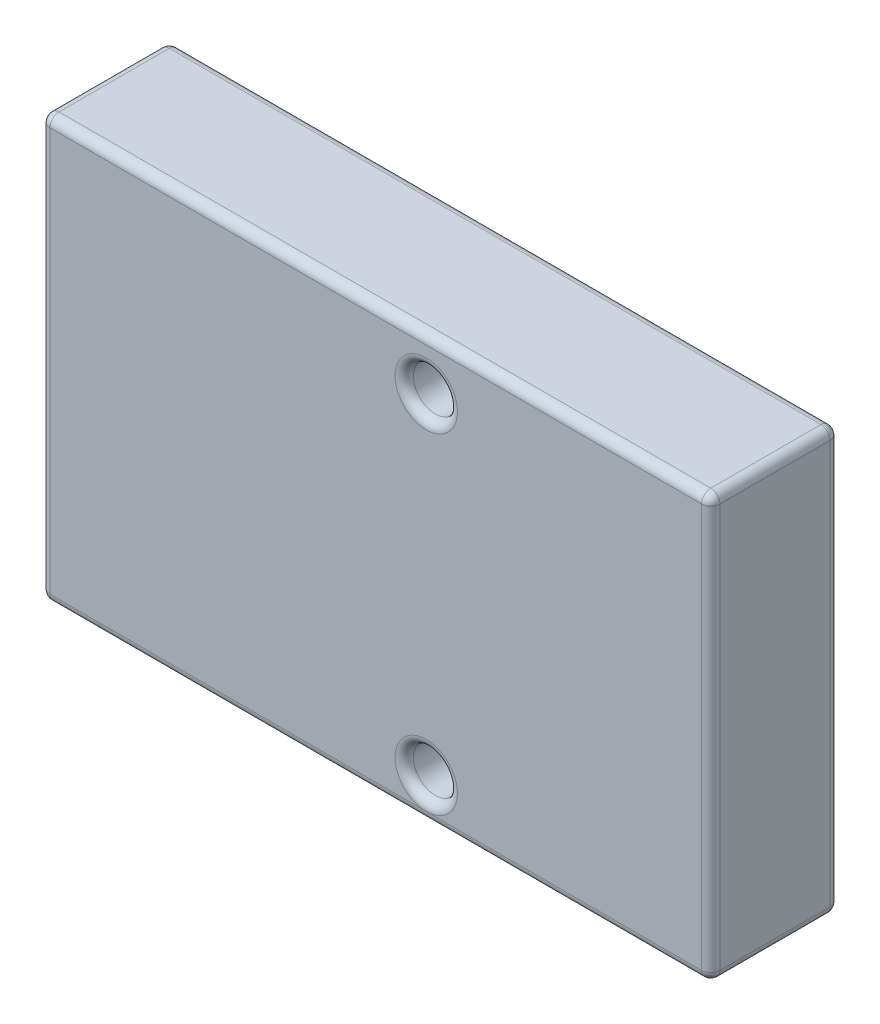
ISO-10303-21;
HEADER;
FILE_DESCRIPTION(('STEP AP214'),'2;1');
FILE_NAME('part.step','',(''),(''),'','','');
FILE_SCHEMA(('AUTOMOTIVE_DESIGN { 1 0 10303 214 1 1 1 1 }'));
ENDSEC;
DATA;
#1=APPLICATION_CONTEXT('core data for automotive mechanical design processes');
#2=APPLICATION_PROTOCOL_DEFINITION('international standard','automotive_design',2000,#1);
#3=PRODUCT_CONTEXT('',#1,'mechanical');
#4=PRODUCT('Part','Part','',(#3));
#5=PRODUCT_RELATED_PRODUCT_CATEGORY('part','',(#4));
#6=PRODUCT_DEFINITION_FORMATION('','',#4);
#7=PRODUCT_DEFINITION_CONTEXT('part definition',#1,'design');
#8=PRODUCT_DEFINITION('design','',#6,#7);
#9=PRODUCT_DEFINITION_SHAPE('','',#8);
#10=(LENGTH_UNIT() NAMED_UNIT(*) SI_UNIT(.MILLI.,.METRE.));
#11=(NAMED_UNIT(*) PLANE_ANGLE_UNIT() SI_UNIT($,.RADIAN.));
#12=(NAMED_UNIT(*) SI_UNIT($,.STERADIAN.) SOLID_ANGLE_UNIT());
#13=UNCERTAINTY_MEASURE_WITH_UNIT(LENGTH_MEASURE(1.E-05),#10,'distance_accuracy_value','');
#14=(GEOMETRIC_REPRESENTATION_CONTEXT(3) GLOBAL_UNCERTAINTY_ASSIGNED_CONTEXT((#13)) GLOBAL_UNIT_ASSIGNED_CONTEXT((#10,
#11,#12)) REPRESENTATION_CONTEXT('',''));
#15=CARTESIAN_POINT('',(0.,0.,0.));
#16=DIRECTION('',(0.,0.,1.));
#17=DIRECTION('',(1.,0.,0.));
#18=AXIS2_PLACEMENT_3D('',#15,#16,#17);
#19=CARTESIAN_POINT('',(0.,23.,7.));
#20=DIRECTION('',(1.,0.,0.));
#21=DIRECTION('',(0.,0.,-1.));
#22=AXIS2_PLACEMENT_3D('',#19,#20,#21);
#23=PLANE('',#22);
#24=DIRECTION('',(0.,0.,1.));
#25=VECTOR('',#24,1.);
#26=CARTESIAN_POINT('',(0.,22.5,7.));
#27=LINE('',#26,#25);
#28=CARTESIAN_POINT('',(0.,22.5,6.5));
#29=VERTEX_POINT('',#28);
#30=CARTESIAN_POINT('',(0.,22.5,0.5));
#31=VERTEX_POINT('',#30);
#32=EDGE_CURVE('E276',#29,#31,#27,.F.);
#33=ORIENTED_EDGE('',*,*,#32,.T.);
#34=DIRECTION('',(0.,-1.,0.));
#35=VECTOR('',#34,1.);
#36=CARTESIAN_POINT('',(0.,23.,0.5));
#37=LINE('',#36,#35);
#38=CARTESIAN_POINT('',(0.,0.5,0.5));
#39=VERTEX_POINT('',#38);
#40=EDGE_CURVE('E374',#31,#39,#37,.T.);
#41=ORIENTED_EDGE('',*,*,#40,.T.);
#42=DIRECTION('',(0.,0.,1.));
#43=VECTOR('',#42,1.);
#44=CARTESIAN_POINT('',(0.,0.5,7.));
#45=LINE('',#44,#43);
#46=CARTESIAN_POINT('',(0.,0.5,6.5));
#47=VERTEX_POINT('',#46);
#48=EDGE_CURVE('E369',#39,#47,#45,.T.);
#49=ORIENTED_EDGE('',*,*,#48,.T.);
#50=DIRECTION('',(0.,-1.,0.));
#51=VECTOR('',#50,1.);
#52=CARTESIAN_POINT('',(0.,23.,6.5));
#53=LINE('',#52,#51);
#54=EDGE_CURVE('E371',#47,#29,#53,.F.);
#55=ORIENTED_EDGE('',*,*,#54,.T.);
#56=EDGE_LOOP('',(#33,#41,#49,#55));
#57=FACE_BOUND('',#56,.T.);
#58=ADVANCED_FACE('F141',(#57),#23,.F.);
#59=CARTESIAN_POINT('',(36.5,23.,7.));
#60=DIRECTION('',(0.,0.,-1.));
#61=DIRECTION('',(-1.,0.,0.));
#62=AXIS2_PLACEMENT_3D('',#59,#60,#61);
#63=PLANE('',#62);
#64=CARTESIAN_POINT('',(21.,20.2,7.));
#65=DIRECTION('',(0.,0.,-1.));
#66=DIRECTION('',(-1.,0.,0.));
#67=AXIS2_PLACEMENT_3D('',#64,#65,#66);
#68=CIRCLE('',#67,1.7);
#69=CARTESIAN_POINT('',(19.3,20.2,7.));
#70=VERTEX_POINT('',#69);
#71=EDGE_CURVE('E403',#70,#70,#68,.T.);
#72=ORIENTED_EDGE('',*,*,#71,.T.);
#73=EDGE_LOOP('',(#72));
#74=FACE_BOUND('',#73,.T.);
#75=CARTESIAN_POINT('',(21.,2.2,7.));
#76=DIRECTION('',(0.,0.,-1.));
#77=DIRECTION('',(-1.,0.,0.));
#78=AXIS2_PLACEMENT_3D('',#75,#76,#77);
#79=CIRCLE('',#78,1.7);
#80=CARTESIAN_POINT('',(21.,0.5,7.));
#81=VERTEX_POINT('',#80);
#82=CARTESIAN_POINT('',(19.3,2.2,7.));
#83=VERTEX_POINT('',#82);
#84=EDGE_CURVE('E398',#81,#83,#79,.T.);
#85=ORIENTED_EDGE('',*,*,#84,.T.);
#86=CARTESIAN_POINT('',(21.,2.2,7.));
#87=DIRECTION('',(0.,0.,-1.));
#88=DIRECTION('',(-1.,0.,0.));
#89=AXIS2_PLACEMENT_3D('',#86,#87,#88);
#90=CIRCLE('',#89,1.7);
#91=EDGE_CURVE('E400',#83,#81,#90,.T.);
#92=ORIENTED_EDGE('',*,*,#91,.T.);
#93=DIRECTION('',(1.,0.,0.));
#94=VECTOR('',#93,1.);
#95=CARTESIAN_POINT('',(36.5,0.5,7.));
#96=LINE('',#95,#94);
#97=CARTESIAN_POINT('',(36.,0.5,7.));
#98=VERTEX_POINT('',#97);
#99=EDGE_CURVE('E386',#81,#98,#96,.T.);
#100=ORIENTED_EDGE('',*,*,#99,.T.);
#101=DIRECTION('',(0.,-1.,0.));
#102=VECTOR('',#101,1.);
#103=CARTESIAN_POINT('',(36.,23.,7.));
#104=LINE('',#103,#102);
#105=CARTESIAN_POINT('',(36.,22.5,7.));
#106=VERTEX_POINT('',#105);
#107=EDGE_CURVE('E391',#98,#106,#104,.F.);
#108=ORIENTED_EDGE('',*,*,#107,.T.);
#109=DIRECTION('',(1.,0.,0.));
#110=VECTOR('',#109,1.);
#111=CARTESIAN_POINT('',(36.5,22.5,7.));
#112=LINE('',#111,#110);
#113=CARTESIAN_POINT('',(0.5,22.5,7.));
#114=VERTEX_POINT('',#113);
#115=EDGE_CURVE('E393',#106,#114,#112,.F.);
#116=ORIENTED_EDGE('',*,*,#115,.T.);
#117=DIRECTION('',(0.,-1.,0.));
#118=VECTOR('',#117,1.);
#119=CARTESIAN_POINT('',(0.5,23.,7.));
#120=LINE('',#119,#118);
#121=CARTESIAN_POINT('',(0.5,0.5,7.));
#122=VERTEX_POINT('',#121);
#123=EDGE_CURVE('E395',#114,#122,#120,.T.);
#124=ORIENTED_EDGE('',*,*,#123,.T.);
#125=DIRECTION('',(1.,0.,0.));
#126=VECTOR('',#125,1.);
#127=CARTESIAN_POINT('',(36.5,0.5,7.));
#128=LINE('',#127,#126);
#129=EDGE_CURVE('E388',#122,#81,#128,.T.);
#130=ORIENTED_EDGE('',*,*,#129,.T.);
#131=EDGE_LOOP('',(#85,#92,#100,#108,#116,#124,#130));
#132=FACE_BOUND('',#131,.T.);
#133=ADVANCED_FACE('F465',(#74,#132),#63,.F.);
#134=CARTESIAN_POINT('',(36.5,23.,0.));
#135=DIRECTION('',(-1.,0.,0.));
#136=DIRECTION('',(0.,0.,1.));
#137=AXIS2_PLACEMENT_3D('',#134,#135,#136);
#138=PLANE('',#137);
#139=DIRECTION('',(0.,-1.,0.));
#140=VECTOR('',#139,1.);
#141=CARTESIAN_POINT('',(36.5,23.,0.5));
#142=LINE('',#141,#140);
#143=CARTESIAN_POINT('',(36.5,0.5,0.5));
#144=VERTEX_POINT('',#143);
#145=CARTESIAN_POINT('',(36.5,22.5,0.5));
#146=VERTEX_POINT('',#145);
#147=EDGE_CURVE('E381',#144,#146,#142,.F.);
#148=ORIENTED_EDGE('',*,*,#147,.T.);
#149=DIRECTION('',(0.,0.,-1.));
#150=VECTOR('',#149,1.);
#151=CARTESIAN_POINT('',(36.5,22.5,0.));
#152=LINE('',#151,#150);
#153=CARTESIAN_POINT('',(36.5,22.5,6.5));
#154=VERTEX_POINT('',#153);
#155=EDGE_CURVE('E383',#146,#154,#152,.F.);
#156=ORIENTED_EDGE('',*,*,#155,.T.);
#157=DIRECTION('',(0.,-1.,0.));
#158=VECTOR('',#157,1.);
#159=CARTESIAN_POINT('',(36.5,23.,6.5));
#160=LINE('',#159,#158);
#161=CARTESIAN_POINT('',(36.5,0.5,6.5));
#162=VERTEX_POINT('',#161);
#163=EDGE_CURVE('E379',#154,#162,#160,.T.);
#164=ORIENTED_EDGE('',*,*,#163,.T.);
#165=DIRECTION('',(0.,0.,-1.));
#166=VECTOR('',#165,1.);
#167=CARTESIAN_POINT('',(36.5,0.5,0.));
#168=LINE('',#167,#166);
#169=EDGE_CURVE('E377',#162,#144,#168,.T.);
#170=ORIENTED_EDGE('',*,*,#169,.T.);
#171=EDGE_LOOP('',(#148,#156,#164,#170));
#172=FACE_BOUND('',#171,.T.);
#173=ADVANCED_FACE('F479',(#172),#138,.F.);
#174=CARTESIAN_POINT('',(0.,23.,0.));
#175=DIRECTION('',(0.,0.,1.));
#176=DIRECTION('',(1.,0.,0.));
#177=AXIS2_PLACEMENT_3D('',#174,#175,#176);
#178=PLANE('',#177);
#179=CARTESIAN_POINT('',(21.,20.2,0.));
#180=DIRECTION('',(0.,0.,1.));
#181=DIRECTION('',(1.,0.,0.));
#182=AXIS2_PLACEMENT_3D('',#179,#180,#181);
#183=CIRCLE('',#182,1.7);
#184=CARTESIAN_POINT('',(22.7,20.2,0.));
#185=VERTEX_POINT('',#184);
#186=EDGE_CURVE('E354',#185,#185,#183,.T.);
#187=ORIENTED_EDGE('',*,*,#186,.T.);
#188=EDGE_LOOP('',(#187));
#189=FACE_BOUND('',#188,.T.);
#190=CARTESIAN_POINT('',(21.,2.2,0.));
#191=DIRECTION('',(0.,0.,1.));
#192=DIRECTION('',(1.,0.,0.));
#193=AXIS2_PLACEMENT_3D('',#190,#191,#192);
#194=CIRCLE('',#193,1.7);
#195=CARTESIAN_POINT('',(21.,0.5,0.));
#196=VERTEX_POINT('',#195);
#197=CARTESIAN_POINT('',(19.3,2.2,0.));
#198=VERTEX_POINT('',#197);
#199=EDGE_CURVE('E349',#196,#198,#194,.T.);
#200=ORIENTED_EDGE('',*,*,#199,.T.);
#201=CARTESIAN_POINT('',(21.,2.2,0.));
#202=DIRECTION('',(0.,0.,1.));
#203=DIRECTION('',(1.,0.,0.));
#204=AXIS2_PLACEMENT_3D('',#201,#202,#203);
#205=CIRCLE('',#204,1.7);
#206=EDGE_CURVE('E351',#198,#196,#205,.T.);
#207=ORIENTED_EDGE('',*,*,#206,.T.);
#208=DIRECTION('',(-1.,0.,0.));
#209=VECTOR('',#208,1.);
#210=CARTESIAN_POINT('',(0.,0.5,0.));
#211=LINE('',#210,#209);
#212=CARTESIAN_POINT('',(0.5,0.5,0.));
#213=VERTEX_POINT('',#212);
#214=EDGE_CURVE('E337',#196,#213,#211,.T.);
#215=ORIENTED_EDGE('',*,*,#214,.T.);
#216=DIRECTION('',(0.,-1.,0.));
#217=VECTOR('',#216,1.);
#218=CARTESIAN_POINT('',(0.5,23.,0.));
#219=LINE('',#218,#217);
#220=CARTESIAN_POINT('',(0.5,22.5,0.));
#221=VERTEX_POINT('',#220);
#222=EDGE_CURVE('E344',#213,#221,#219,.F.);
#223=ORIENTED_EDGE('',*,*,#222,.T.);
#224=DIRECTION('',(-1.,0.,0.));
#225=VECTOR('',#224,1.);
#226=CARTESIAN_POINT('',(0.,22.5,0.));
#227=LINE('',#226,#225);
#228=CARTESIAN_POINT('',(36.,22.5,0.));
#229=VERTEX_POINT('',#228);
#230=EDGE_CURVE('E346',#221,#229,#227,.F.);
#231=ORIENTED_EDGE('',*,*,#230,.T.);
#232=DIRECTION('',(0.,-1.,0.));
#233=VECTOR('',#232,1.);
#234=CARTESIAN_POINT('',(36.,23.,0.));
#235=LINE('',#234,#233);
#236=CARTESIAN_POINT('',(36.,0.5,0.));
#237=VERTEX_POINT('',#236);
#238=EDGE_CURVE('E342',#229,#237,#235,.T.);
#239=ORIENTED_EDGE('',*,*,#238,.T.);
#240=DIRECTION('',(-1.,0.,0.));
#241=VECTOR('',#240,1.);
#242=CARTESIAN_POINT('',(0.,0.5,0.));
#243=LINE('',#242,#241);
#244=EDGE_CURVE('E339',#237,#196,#243,.T.);
#245=ORIENTED_EDGE('',*,*,#244,.T.);
#246=EDGE_LOOP('',(#200,#207,#215,#223,#231,#239,#245));
#247=FACE_BOUND('',#246,.T.);
#248=ADVANCED_FACE('F446',(#189,#247),#178,.F.);
#249=CARTESIAN_POINT('',(0.,23.,0.));
#250=DIRECTION('',(0.,-1.,0.));
#251=DIRECTION('',(0.,0.,-1.));
#252=AXIS2_PLACEMENT_3D('',#249,#250,#251);
#253=PLANE('',#252);
#254=DIRECTION('',(0.,0.,-1.));
#255=VECTOR('',#254,1.);
#256=CARTESIAN_POINT('',(36.,23.,0.));
#257=LINE('',#256,#255);
#258=CARTESIAN_POINT('',(36.,23.,6.5));
#259=VERTEX_POINT('',#258);
#260=CARTESIAN_POINT('',(36.,23.,0.5));
#261=VERTEX_POINT('',#260);
#262=EDGE_CURVE('E253',#259,#261,#257,.T.);
#263=ORIENTED_EDGE('',*,*,#262,.T.);
#264=DIRECTION('',(-1.,0.,0.));
#265=VECTOR('',#264,1.);
#266=CARTESIAN_POINT('',(0.,23.,0.5));
#267=LINE('',#266,#265);
#268=CARTESIAN_POINT('',(0.5,23.,0.5));
#269=VERTEX_POINT('',#268);
#270=EDGE_CURVE('E249',#261,#269,#267,.T.);
#271=ORIENTED_EDGE('',*,*,#270,.T.);
#272=DIRECTION('',(0.,0.,1.));
#273=VECTOR('',#272,1.);
#274=CARTESIAN_POINT('',(0.5,23.,0.));
#275=LINE('',#274,#273);
#276=CARTESIAN_POINT('',(0.5,23.,6.5));
#277=VERTEX_POINT('',#276);
#278=EDGE_CURVE('E243',#269,#277,#275,.T.);
#279=ORIENTED_EDGE('',*,*,#278,.T.);
#280=DIRECTION('',(1.,0.,0.));
#281=VECTOR('',#280,1.);
#282=CARTESIAN_POINT('',(0.,23.,6.5));
#283=LINE('',#282,#281);
#284=EDGE_CURVE('E246',#277,#259,#283,.T.);
#285=ORIENTED_EDGE('',*,*,#284,.T.);
#286=EDGE_LOOP('',(#263,#271,#279,#285));
#287=FACE_BOUND('',#286,.T.);
#288=ADVANCED_FACE('F245',(#287),#253,.F.);
#289=CARTESIAN_POINT('',(0.,0.,0.));
#290=DIRECTION('',(0.,-1.,0.));
#291=DIRECTION('',(0.,0.,-1.));
#292=AXIS2_PLACEMENT_3D('',#289,#290,#291);
#293=PLANE('',#292);
#294=DIRECTION('',(0.,0.,-1.));
#295=VECTOR('',#294,1.);
#296=CARTESIAN_POINT('',(36.,0.,7.));
#297=LINE('',#296,#295);
#298=CARTESIAN_POINT('',(36.,0.,0.5));
#299=VERTEX_POINT('',#298);
#300=CARTESIAN_POINT('',(36.,0.,6.5));
#301=VERTEX_POINT('',#300);
#302=EDGE_CURVE('E158',#299,#301,#297,.F.);
#303=ORIENTED_EDGE('',*,*,#302,.T.);
#304=DIRECTION('',(1.,0.,0.));
#305=VECTOR('',#304,1.);
#306=CARTESIAN_POINT('',(0.,0.,6.5));
#307=LINE('',#306,#305);
#308=CARTESIAN_POINT('',(0.5,0.,6.5));
#309=VERTEX_POINT('',#308);
#310=EDGE_CURVE('E416',#301,#309,#307,.F.);
#311=ORIENTED_EDGE('',*,*,#310,.T.);
#312=DIRECTION('',(0.,0.,1.));
#313=VECTOR('',#312,1.);
#314=CARTESIAN_POINT('',(0.5,0.,0.));
#315=LINE('',#314,#313);
#316=CARTESIAN_POINT('',(0.5,0.,0.5));
#317=VERTEX_POINT('',#316);
#318=EDGE_CURVE('E412',#309,#317,#315,.F.);
#319=ORIENTED_EDGE('',*,*,#318,.T.);
#320=DIRECTION('',(-1.,0.,0.));
#321=VECTOR('',#320,1.);
#322=CARTESIAN_POINT('',(36.5,0.,0.5));
#323=LINE('',#322,#321);
#324=EDGE_CURVE('E163',#317,#299,#323,.F.);
#325=ORIENTED_EDGE('',*,*,#324,.T.);
#326=EDGE_LOOP('',(#303,#311,#319,#325));
#327=FACE_BOUND('',#326,.T.);
#328=CARTESIAN_POINT('',(28.5,0.,3.));
#329=DIRECTION('',(0.,-1.,0.));
#330=DIRECTION('',(0.,0.,-1.));
#331=AXIS2_PLACEMENT_3D('',#328,#329,#330);
#332=CIRCLE('',#331,1.875);
#333=CARTESIAN_POINT('',(28.5,0.,1.125));
#334=VERTEX_POINT('',#333);
#335=EDGE_CURVE('E409',#334,#334,#332,.F.);
#336=ORIENTED_EDGE('',*,*,#335,.T.);
#337=EDGE_LOOP('',(#336));
#338=FACE_BOUND('',#337,.T.);
#339=CARTESIAN_POINT('',(8.,0.,3.));
#340=DIRECTION('',(0.,-1.,0.));
#341=DIRECTION('',(0.,0.,-1.));
#342=AXIS2_PLACEMENT_3D('',#339,#340,#341);
#343=CIRCLE('',#342,1.875);
#344=CARTESIAN_POINT('',(8.,0.,1.125));
#345=VERTEX_POINT('',#344);
#346=EDGE_CURVE('E406',#345,#345,#343,.F.);
#347=ORIENTED_EDGE('',*,*,#346,.T.);
#348=EDGE_LOOP('',(#347));
#349=FACE_BOUND('',#348,.T.);
#350=ADVANCED_FACE('F782',(#327,#338,#349),#293,.T.);
#351=CARTESIAN_POINT('',(28.5,8.5,3.));
#352=DIRECTION('',(0.,-1.,0.));
#353=DIRECTION('',(0.,0.,-1.));
#354=AXIS2_PLACEMENT_3D('',#351,#352,#353);
#355=CYLINDRICAL_SURFACE('',#354,1.375);
#356=CARTESIAN_POINT('',(28.5,0.5,3.));
#357=DIRECTION('',(0.,-1.,0.));
#358=DIRECTION('',(0.,0.,-1.));
#359=AXIS2_PLACEMENT_3D('',#356,#357,#358);
#360=CIRCLE('',#359,1.375);
#361=CARTESIAN_POINT('',(28.5,0.5,1.625));
#362=VERTEX_POINT('',#361);
#363=EDGE_CURVE('E150',#362,#362,#360,.T.);
#364=ORIENTED_EDGE('',*,*,#363,.T.);
#365=EDGE_LOOP('',(#364));
#366=FACE_BOUND('',#365,.T.);
#367=CARTESIAN_POINT('',(28.5,8.5,3.));
#368=DIRECTION('',(0.,-1.,0.));
#369=DIRECTION('',(0.,0.,-1.));
#370=AXIS2_PLACEMENT_3D('',#367,#368,#369);
#371=CIRCLE('',#370,1.375);
#372=CARTESIAN_POINT('',(28.5,8.5,1.625));
#373=VERTEX_POINT('',#372);
#374=EDGE_CURVE('E323',#373,#373,#371,.T.);
#375=ORIENTED_EDGE('',*,*,#374,.F.);
#376=EDGE_LOOP('',(#375));
#377=FACE_BOUND('',#376,.T.);
#378=ADVANCED_FACE('F775',(#366,#377),#355,.F.);
#379=CARTESIAN_POINT('',(28.5,8.5,3.));
#380=DIRECTION('',(0.,-1.,0.));
#381=DIRECTION('',(0.,0.,-1.));
#382=AXIS2_PLACEMENT_3D('',#379,#380,#381);
#383=PLANE('',#382);
#384=ORIENTED_EDGE('',*,*,#374,.T.);
#385=EDGE_LOOP('',(#384));
#386=FACE_BOUND('',#385,.T.);
#387=ADVANCED_FACE('F766',(#386),#383,.T.);
#388=CARTESIAN_POINT('',(8.,8.5,3.));
#389=DIRECTION('',(0.,-1.,0.));
#390=DIRECTION('',(0.,0.,-1.));
#391=AXIS2_PLACEMENT_3D('',#388,#389,#390);
#392=CYLINDRICAL_SURFACE('',#391,1.375);
#393=CARTESIAN_POINT('',(8.,0.5,3.));
#394=DIRECTION('',(0.,-1.,0.));
#395=DIRECTION('',(0.,0.,-1.));
#396=AXIS2_PLACEMENT_3D('',#393,#394,#395);
#397=CIRCLE('',#396,1.375);
#398=CARTESIAN_POINT('',(8.,0.5,1.625));
#399=VERTEX_POINT('',#398);
#400=EDGE_CURVE('E12',#399,#399,#397,.T.);
#401=ORIENTED_EDGE('',*,*,#400,.T.);
#402=EDGE_LOOP('',(#401));
#403=FACE_BOUND('',#402,.T.);
#404=CARTESIAN_POINT('',(8.,8.5,3.));
#405=DIRECTION('',(0.,-1.,0.));
#406=DIRECTION('',(0.,0.,-1.));
#407=AXIS2_PLACEMENT_3D('',#404,#405,#406);
#408=CIRCLE('',#407,1.375);
#409=CARTESIAN_POINT('',(8.,8.5,1.625));
#410=VERTEX_POINT('',#409);
#411=EDGE_CURVE('E265',#410,#410,#408,.T.);
#412=ORIENTED_EDGE('',*,*,#411,.F.);
#413=EDGE_LOOP('',(#412));
#414=FACE_BOUND('',#413,.T.);
#415=ADVANCED_FACE('F757',(#403,#414),#392,.F.);
#416=CARTESIAN_POINT('',(8.,8.5,3.));
#417=DIRECTION('',(0.,-1.,0.));
#418=DIRECTION('',(0.,0.,-1.));
#419=AXIS2_PLACEMENT_3D('',#416,#417,#418);
#420=PLANE('',#419);
#421=ORIENTED_EDGE('',*,*,#411,.T.);
#422=EDGE_LOOP('',(#421));
#423=FACE_BOUND('',#422,.T.);
#424=ADVANCED_FACE('F747',(#423),#420,.T.);
#425=CARTESIAN_POINT('',(21.,20.2,7.));
#426=DIRECTION('',(0.,0.,-1.));
#427=DIRECTION('',(-1.,0.,0.));
#428=AXIS2_PLACEMENT_3D('',#425,#426,#427);
#429=CYLINDRICAL_SURFACE('',#428,1.2);
#430=CARTESIAN_POINT('',(21.,20.2,0.5));
#431=DIRECTION('',(0.,0.,1.));
#432=DIRECTION('',(1.,0.,0.));
#433=AXIS2_PLACEMENT_3D('',#430,#431,#432);
#434=CIRCLE('',#433,1.2);
#435=CARTESIAN_POINT('',(22.2,20.2,0.5));
#436=VERTEX_POINT('',#435);
#437=EDGE_CURVE('E360',#436,#436,#434,.F.);
#438=ORIENTED_EDGE('',*,*,#437,.T.);
#439=EDGE_LOOP('',(#438));
#440=FACE_BOUND('',#439,.T.);
#441=CARTESIAN_POINT('',(21.,20.2,6.5));
#442=DIRECTION('',(0.,0.,-1.));
#443=DIRECTION('',(-1.,0.,0.));
#444=AXIS2_PLACEMENT_3D('',#441,#442,#443);
#445=CIRCLE('',#444,1.2);
#446=CARTESIAN_POINT('',(19.8,20.2,6.5));
#447=VERTEX_POINT('',#446);
#448=EDGE_CURVE('E357',#447,#447,#445,.F.);
#449=ORIENTED_EDGE('',*,*,#448,.T.);
#450=EDGE_LOOP('',(#449));
#451=FACE_BOUND('',#450,.T.);
#452=ADVANCED_FACE('F506',(#440,#451),#429,.F.);
#453=CARTESIAN_POINT('',(21.,2.2,7.));
#454=DIRECTION('',(0.,0.,-1.));
#455=DIRECTION('',(-1.,0.,0.));
#456=AXIS2_PLACEMENT_3D('',#453,#454,#455);
#457=CYLINDRICAL_SURFACE('',#456,1.2);
#458=CARTESIAN_POINT('',(21.,2.2,0.5));
#459=DIRECTION('',(0.,0.,1.));
#460=DIRECTION('',(1.,0.,0.));
#461=AXIS2_PLACEMENT_3D('',#458,#459,#460);
#462=CIRCLE('',#461,1.2);
#463=CARTESIAN_POINT('',(22.2,2.2,0.5));
#464=VERTEX_POINT('',#463);
#465=EDGE_CURVE('E366',#464,#464,#462,.F.);
#466=ORIENTED_EDGE('',*,*,#465,.T.);
#467=EDGE_LOOP('',(#466));
#468=FACE_BOUND('',#467,.T.);
#469=CARTESIAN_POINT('',(21.,2.2,6.5));
#470=DIRECTION('',(0.,0.,-1.));
#471=DIRECTION('',(-1.,0.,0.));
#472=AXIS2_PLACEMENT_3D('',#469,#470,#471);
#473=CIRCLE('',#472,1.2);
#474=CARTESIAN_POINT('',(19.8,2.2,6.5));
#475=VERTEX_POINT('',#474);
#476=EDGE_CURVE('E363',#475,#475,#473,.F.);
#477=ORIENTED_EDGE('',*,*,#476,.T.);
#478=EDGE_LOOP('',(#477));
#479=FACE_BOUND('',#478,.T.);
#480=ADVANCED_FACE('F502',(#468,#479),#457,.F.);
#481=CARTESIAN_POINT('',(36.5,0.5,6.5));
#482=DIRECTION('',(-1.,0.,0.));
#483=DIRECTION('',(0.,0.,1.));
#484=AXIS2_PLACEMENT_3D('',#481,#482,#483);
#485=CYLINDRICAL_SURFACE('',#484,0.5);
#486=CARTESIAN_POINT('',(36.,0.5,6.5));
#487=DIRECTION('',(1.,0.,0.));
#488=DIRECTION('',(0.,0.,-1.));
#489=AXIS2_PLACEMENT_3D('',#486,#487,#488);
#490=CIRCLE('',#489,0.5);
#491=EDGE_CURVE('E145',#98,#301,#490,.T.);
#492=ORIENTED_EDGE('',*,*,#491,.F.);
#493=ORIENTED_EDGE('',*,*,#99,.F.);
#494=ORIENTED_EDGE('',*,*,#129,.F.);
#495=CARTESIAN_POINT('',(0.5,0.5,6.5));
#496=DIRECTION('',(-1.,0.,0.));
#497=DIRECTION('',(0.,0.,1.));
#498=AXIS2_PLACEMENT_3D('',#495,#496,#497);
#499=CIRCLE('',#498,0.5);
#500=EDGE_CURVE('E315',#309,#122,#499,.T.);
#501=ORIENTED_EDGE('',*,*,#500,.F.);
#502=ORIENTED_EDGE('',*,*,#310,.F.);
#503=EDGE_LOOP('',(#492,#493,#494,#501,#502));
#504=FACE_BOUND('',#503,.T.);
#505=ADVANCED_FACE('F505',(#504),#485,.T.);
#506=CARTESIAN_POINT('',(36.,0.5,6.5));
#507=DIRECTION('',(0.,0.,1.));
#508=DIRECTION('',(1.,0.,0.));
#509=AXIS2_PLACEMENT_3D('',#506,#507,#508);
#510=SPHERICAL_SURFACE('',#509,0.5);
#511=CARTESIAN_POINT('',(36.,0.5,6.5));
#512=DIRECTION('',(0.,-1.,0.));
#513=DIRECTION('',(0.,0.,-1.));
#514=AXIS2_PLACEMENT_3D('',#511,#512,#513);
#515=CIRCLE('',#514,0.5);
#516=EDGE_CURVE('E310',#98,#162,#515,.F.);
#517=ORIENTED_EDGE('',*,*,#516,.F.);
#518=ORIENTED_EDGE('',*,*,#491,.T.);
#519=CARTESIAN_POINT('',(36.,0.5,6.5));
#520=DIRECTION('',(0.,0.,1.));
#521=DIRECTION('',(1.,0.,0.));
#522=AXIS2_PLACEMENT_3D('',#519,#520,#521);
#523=CIRCLE('',#522,0.5);
#524=EDGE_CURVE('E313',#162,#301,#523,.F.);
#525=ORIENTED_EDGE('',*,*,#524,.F.);
#526=EDGE_LOOP('',(#517,#518,#525));
#527=FACE_BOUND('',#526,.T.);
#528=ADVANCED_FACE('F517',(#527),#510,.T.);
#529=CARTESIAN_POINT('',(0.5,0.5,6.5));
#530=DIRECTION('',(0.,0.,1.));
#531=DIRECTION('',(1.,0.,0.));
#532=AXIS2_PLACEMENT_3D('',#529,#530,#531);
#533=SPHERICAL_SURFACE('',#532,0.5);
#534=CARTESIAN_POINT('',(0.5,0.5,6.5));
#535=DIRECTION('',(0.,0.,1.));
#536=DIRECTION('',(1.,0.,0.));
#537=AXIS2_PLACEMENT_3D('',#534,#535,#536);
#538=CIRCLE('',#537,0.5);
#539=EDGE_CURVE('E305',#309,#47,#538,.F.);
#540=ORIENTED_EDGE('',*,*,#539,.F.);
#541=ORIENTED_EDGE('',*,*,#500,.T.);
#542=CARTESIAN_POINT('',(0.5,0.5,6.5));
#543=DIRECTION('',(0.,-1.,0.));
#544=DIRECTION('',(0.,0.,-1.));
#545=AXIS2_PLACEMENT_3D('',#542,#543,#544);
#546=CIRCLE('',#545,0.5);
#547=EDGE_CURVE('E308',#47,#122,#546,.F.);
#548=ORIENTED_EDGE('',*,*,#547,.F.);
#549=EDGE_LOOP('',(#540,#541,#548));
#550=FACE_BOUND('',#549,.T.);
#551=ADVANCED_FACE('F519',(#550),#533,.T.);
#552=CARTESIAN_POINT('',(36.,0.5,0.));
#553=DIRECTION('',(0.,0.,1.));
#554=DIRECTION('',(1.,0.,0.));
#555=AXIS2_PLACEMENT_3D('',#552,#553,#554);
#556=CYLINDRICAL_SURFACE('',#555,0.5);
#557=ORIENTED_EDGE('',*,*,#524,.T.);
#558=ORIENTED_EDGE('',*,*,#302,.F.);
#559=CARTESIAN_POINT('',(36.,0.5,0.5));
#560=DIRECTION('',(0.,0.,-1.));
#561=DIRECTION('',(-1.,0.,0.));
#562=AXIS2_PLACEMENT_3D('',#559,#560,#561);
#563=CIRCLE('',#562,0.5);
#564=EDGE_CURVE('E299',#144,#299,#563,.T.);
#565=ORIENTED_EDGE('',*,*,#564,.F.);
#566=ORIENTED_EDGE('',*,*,#169,.F.);
#567=EDGE_LOOP('',(#557,#558,#565,#566));
#568=FACE_BOUND('',#567,.T.);
#569=ADVANCED_FACE('F483',(#568),#556,.T.);
#570=CARTESIAN_POINT('',(36.,23.,6.5));
#571=DIRECTION('',(0.,-1.,0.));
#572=DIRECTION('',(0.,0.,-1.));
#573=AXIS2_PLACEMENT_3D('',#570,#571,#572);
#574=CYLINDRICAL_SURFACE('',#573,0.5);
#575=ORIENTED_EDGE('',*,*,#516,.T.);
#576=ORIENTED_EDGE('',*,*,#163,.F.);
#577=CARTESIAN_POINT('',(36.,22.5,6.5));
#578=DIRECTION('',(0.,1.,0.));
#579=DIRECTION('',(0.,0.,1.));
#580=AXIS2_PLACEMENT_3D('',#577,#578,#579);
#581=CIRCLE('',#580,0.5);
#582=EDGE_CURVE('E296',#106,#154,#581,.T.);
#583=ORIENTED_EDGE('',*,*,#582,.F.);
#584=ORIENTED_EDGE('',*,*,#107,.F.);
#585=EDGE_LOOP('',(#575,#576,#583,#584));
#586=FACE_BOUND('',#585,.T.);
#587=ADVANCED_FACE('F471',(#586),#574,.T.);
#588=CARTESIAN_POINT('',(0.,22.5,6.5));
#589=DIRECTION('',(1.,0.,0.));
#590=DIRECTION('',(0.,0.,-1.));
#591=AXIS2_PLACEMENT_3D('',#588,#589,#590);
#592=CYLINDRICAL_SURFACE('',#591,0.5);
#593=CARTESIAN_POINT('',(0.5,22.5,6.5));
#594=DIRECTION('',(-1.,0.,0.));
#595=DIRECTION('',(0.,-1.,0.));
#596=AXIS2_PLACEMENT_3D('',#593,#594,#595);
#597=CIRCLE('',#596,0.5);
#598=EDGE_CURVE('E260',#114,#277,#597,.T.);
#599=ORIENTED_EDGE('',*,*,#598,.F.);
#600=ORIENTED_EDGE('',*,*,#115,.F.);
#601=CARTESIAN_POINT('',(36.,22.5,6.5));
#602=DIRECTION('',(1.,0.,0.));
#603=DIRECTION('',(0.,0.,-1.));
#604=AXIS2_PLACEMENT_3D('',#601,#602,#603);
#605=CIRCLE('',#604,0.5);
#606=EDGE_CURVE('E263',#259,#106,#605,.T.);
#607=ORIENTED_EDGE('',*,*,#606,.F.);
#608=ORIENTED_EDGE('',*,*,#284,.F.);
#609=EDGE_LOOP('',(#599,#600,#607,#608));
#610=FACE_BOUND('',#609,.T.);
#611=ADVANCED_FACE('F258',(#610),#592,.T.);
#612=CARTESIAN_POINT('',(0.5,23.,6.5));
#613=DIRECTION('',(0.,-1.,0.));
#614=DIRECTION('',(0.,0.,-1.));
#615=AXIS2_PLACEMENT_3D('',#612,#613,#614);
#616=CYLINDRICAL_SURFACE('',#615,0.5);
#617=ORIENTED_EDGE('',*,*,#547,.T.);
#618=ORIENTED_EDGE('',*,*,#123,.F.);
#619=CARTESIAN_POINT('',(0.5,22.5,6.5));
#620=DIRECTION('',(0.,1.,0.));
#621=DIRECTION('',(0.,0.,1.));
#622=AXIS2_PLACEMENT_3D('',#619,#620,#621);
#623=CIRCLE('',#622,0.5);
#624=EDGE_CURVE('E273',#29,#114,#623,.T.);
#625=ORIENTED_EDGE('',*,*,#624,.F.);
#626=ORIENTED_EDGE('',*,*,#54,.F.);
#627=EDGE_LOOP('',(#617,#618,#625,#626));
#628=FACE_BOUND('',#627,.T.);
#629=ADVANCED_FACE('F463',(#628),#616,.T.);
#630=CARTESIAN_POINT('',(0.5,0.5,7.));
#631=DIRECTION('',(0.,0.,-1.));
#632=DIRECTION('',(-1.,0.,0.));
#633=AXIS2_PLACEMENT_3D('',#630,#631,#632);
#634=CYLINDRICAL_SURFACE('',#633,0.5);
#635=ORIENTED_EDGE('',*,*,#539,.T.);
#636=ORIENTED_EDGE('',*,*,#48,.F.);
#637=CARTESIAN_POINT('',(0.5,0.5,0.5));
#638=DIRECTION('',(0.,0.,-1.));
#639=DIRECTION('',(-1.,0.,0.));
#640=AXIS2_PLACEMENT_3D('',#637,#638,#639);
#641=CIRCLE('',#640,0.5);
#642=EDGE_CURVE('E291',#317,#39,#641,.T.);
#643=ORIENTED_EDGE('',*,*,#642,.F.);
#644=ORIENTED_EDGE('',*,*,#318,.F.);
#645=EDGE_LOOP('',(#635,#636,#643,#644));
#646=FACE_BOUND('',#645,.T.);
#647=ADVANCED_FACE('F562',(#646),#634,.T.);
#648=CARTESIAN_POINT('',(0.,0.5,0.5));
#649=DIRECTION('',(1.,0.,0.));
#650=DIRECTION('',(0.,0.,-1.));
#651=AXIS2_PLACEMENT_3D('',#648,#649,#650);
#652=CYLINDRICAL_SURFACE('',#651,0.5);
#653=CARTESIAN_POINT('',(36.,0.5,0.5));
#654=DIRECTION('',(1.,0.,0.));
#655=DIRECTION('',(0.,0.,-1.));
#656=AXIS2_PLACEMENT_3D('',#653,#654,#655);
#657=CIRCLE('',#656,0.5);
#658=EDGE_CURVE('E302',#299,#237,#657,.T.);
#659=ORIENTED_EDGE('',*,*,#658,.F.);
#660=ORIENTED_EDGE('',*,*,#324,.F.);
#661=CARTESIAN_POINT('',(0.5,0.5,0.5));
#662=DIRECTION('',(-1.,0.,0.));
#663=DIRECTION('',(0.,0.,1.));
#664=AXIS2_PLACEMENT_3D('',#661,#662,#663);
#665=CIRCLE('',#664,0.5);
#666=EDGE_CURVE('E288',#213,#317,#665,.T.);
#667=ORIENTED_EDGE('',*,*,#666,.F.);
#668=ORIENTED_EDGE('',*,*,#214,.F.);
#669=ORIENTED_EDGE('',*,*,#244,.F.);
#670=EDGE_LOOP('',(#659,#660,#667,#668,#669));
#671=FACE_BOUND('',#670,.T.);
#672=ADVANCED_FACE('F488',(#671),#652,.T.);
#673=CARTESIAN_POINT('',(36.,0.5,0.5));
#674=DIRECTION('',(0.,0.,1.));
#675=DIRECTION('',(1.,0.,0.));
#676=AXIS2_PLACEMENT_3D('',#673,#674,#675);
#677=SPHERICAL_SURFACE('',#676,0.5);
#678=ORIENTED_EDGE('',*,*,#564,.T.);
#679=ORIENTED_EDGE('',*,*,#658,.T.);
#680=CARTESIAN_POINT('',(36.,0.5,0.5));
#681=DIRECTION('',(0.,-1.,0.));
#682=DIRECTION('',(0.,0.,-1.));
#683=AXIS2_PLACEMENT_3D('',#680,#681,#682);
#684=CIRCLE('',#683,0.5);
#685=EDGE_CURVE('E280',#144,#237,#684,.F.);
#686=ORIENTED_EDGE('',*,*,#685,.F.);
#687=EDGE_LOOP('',(#678,#679,#686));
#688=FACE_BOUND('',#687,.T.);
#689=ADVANCED_FACE('F486',(#688),#677,.T.);
#690=CARTESIAN_POINT('',(36.,22.5,6.5));
#691=DIRECTION('',(0.,0.,1.));
#692=DIRECTION('',(1.,0.,0.));
#693=AXIS2_PLACEMENT_3D('',#690,#691,#692);
#694=SPHERICAL_SURFACE('',#693,0.5);
#695=ORIENTED_EDGE('',*,*,#606,.T.);
#696=ORIENTED_EDGE('',*,*,#582,.T.);
#697=CARTESIAN_POINT('',(36.,22.5,6.5));
#698=DIRECTION('',(0.,0.,1.));
#699=DIRECTION('',(1.,0.,0.));
#700=AXIS2_PLACEMENT_3D('',#697,#698,#699);
#701=CIRCLE('',#700,0.5);
#702=EDGE_CURVE('E277',#259,#154,#701,.F.);
#703=ORIENTED_EDGE('',*,*,#702,.F.);
#704=EDGE_LOOP('',(#695,#696,#703));
#705=FACE_BOUND('',#704,.T.);
#706=ADVANCED_FACE('F473',(#705),#694,.T.);
#707=CARTESIAN_POINT('',(0.5,22.5,6.5));
#708=DIRECTION('',(0.,0.,1.));
#709=DIRECTION('',(1.,0.,0.));
#710=AXIS2_PLACEMENT_3D('',#707,#708,#709);
#711=SPHERICAL_SURFACE('',#710,0.5);
#712=ORIENTED_EDGE('',*,*,#624,.T.);
#713=ORIENTED_EDGE('',*,*,#598,.T.);
#714=CARTESIAN_POINT('',(0.5,22.5,6.5));
#715=DIRECTION('',(0.,0.,1.));
#716=DIRECTION('',(1.,0.,0.));
#717=AXIS2_PLACEMENT_3D('',#714,#715,#716);
#718=CIRCLE('',#717,0.5);
#719=EDGE_CURVE('E270',#29,#277,#718,.F.);
#720=ORIENTED_EDGE('',*,*,#719,.F.);
#721=EDGE_LOOP('',(#712,#713,#720));
#722=FACE_BOUND('',#721,.T.);
#723=ADVANCED_FACE('F269',(#722),#711,.T.);
#724=CARTESIAN_POINT('',(0.5,0.5,0.5));
#725=DIRECTION('',(0.,0.,1.));
#726=DIRECTION('',(1.,0.,0.));
#727=AXIS2_PLACEMENT_3D('',#724,#725,#726);
#728=SPHERICAL_SURFACE('',#727,0.5);
#729=ORIENTED_EDGE('',*,*,#666,.T.);
#730=ORIENTED_EDGE('',*,*,#642,.T.);
#731=CARTESIAN_POINT('',(0.5,0.5,0.5));
#732=DIRECTION('',(0.,-1.,0.));
#733=DIRECTION('',(0.,0.,-1.));
#734=AXIS2_PLACEMENT_3D('',#731,#732,#733);
#735=CIRCLE('',#734,0.5);
#736=EDGE_CURVE('E278',#213,#39,#735,.F.);
#737=ORIENTED_EDGE('',*,*,#736,.F.);
#738=EDGE_LOOP('',(#729,#730,#737));
#739=FACE_BOUND('',#738,.T.);
#740=ADVANCED_FACE('F550',(#739),#728,.T.);
#741=CARTESIAN_POINT('',(36.,23.,0.5));
#742=DIRECTION('',(0.,-1.,0.));
#743=DIRECTION('',(0.,0.,-1.));
#744=AXIS2_PLACEMENT_3D('',#741,#742,#743);
#745=CYLINDRICAL_SURFACE('',#744,0.5);
#746=ORIENTED_EDGE('',*,*,#685,.T.);
#747=ORIENTED_EDGE('',*,*,#238,.F.);
#748=CARTESIAN_POINT('',(36.,22.5,0.5));
#749=DIRECTION('',(0.,1.,0.));
#750=DIRECTION('',(0.,0.,1.));
#751=AXIS2_PLACEMENT_3D('',#748,#749,#750);
#752=CIRCLE('',#751,0.5);
#753=EDGE_CURVE('E282',#146,#229,#752,.T.);
#754=ORIENTED_EDGE('',*,*,#753,.F.);
#755=ORIENTED_EDGE('',*,*,#147,.F.);
#756=EDGE_LOOP('',(#746,#747,#754,#755));
#757=FACE_BOUND('',#756,.T.);
#758=ADVANCED_FACE('F441',(#757),#745,.T.);
#759=CARTESIAN_POINT('',(36.,22.5,0.));
#760=DIRECTION('',(0.,0.,-1.));
#761=DIRECTION('',(-1.,0.,0.));
#762=AXIS2_PLACEMENT_3D('',#759,#760,#761);
#763=CYLINDRICAL_SURFACE('',#762,0.5);
#764=ORIENTED_EDGE('',*,*,#702,.T.);
#765=ORIENTED_EDGE('',*,*,#155,.F.);
#766=CARTESIAN_POINT('',(36.,22.5,0.5));
#767=DIRECTION('',(0.,0.,-1.));
#768=DIRECTION('',(-1.,0.,0.));
#769=AXIS2_PLACEMENT_3D('',#766,#767,#768);
#770=CIRCLE('',#769,0.5);
#771=EDGE_CURVE('E430',#261,#146,#770,.T.);
#772=ORIENTED_EDGE('',*,*,#771,.F.);
#773=ORIENTED_EDGE('',*,*,#262,.F.);
#774=EDGE_LOOP('',(#764,#765,#772,#773));
#775=FACE_BOUND('',#774,.T.);
#776=ADVANCED_FACE('F477',(#775),#763,.T.);
#777=CARTESIAN_POINT('',(0.5,22.5,0.));
#778=DIRECTION('',(0.,0.,1.));
#779=DIRECTION('',(1.,0.,0.));
#780=AXIS2_PLACEMENT_3D('',#777,#778,#779);
#781=CYLINDRICAL_SURFACE('',#780,0.5);
#782=ORIENTED_EDGE('',*,*,#719,.T.);
#783=ORIENTED_EDGE('',*,*,#278,.F.);
#784=CARTESIAN_POINT('',(0.5,22.5,0.5));
#785=DIRECTION('',(0.,0.,-1.));
#786=DIRECTION('',(0.,1.,0.));
#787=AXIS2_PLACEMENT_3D('',#784,#785,#786);
#788=CIRCLE('',#787,0.5);
#789=EDGE_CURVE('E427',#31,#269,#788,.T.);
#790=ORIENTED_EDGE('',*,*,#789,.F.);
#791=ORIENTED_EDGE('',*,*,#32,.F.);
#792=EDGE_LOOP('',(#782,#783,#790,#791));
#793=FACE_BOUND('',#792,.T.);
#794=ADVANCED_FACE('F275',(#793),#781,.T.);
#795=CARTESIAN_POINT('',(0.5,23.,0.5));
#796=DIRECTION('',(0.,-1.,0.));
#797=DIRECTION('',(0.,0.,-1.));
#798=AXIS2_PLACEMENT_3D('',#795,#796,#797);
#799=CYLINDRICAL_SURFACE('',#798,0.5);
#800=ORIENTED_EDGE('',*,*,#736,.T.);
#801=ORIENTED_EDGE('',*,*,#40,.F.);
#802=CARTESIAN_POINT('',(0.5,22.5,0.5));
#803=DIRECTION('',(0.,1.,0.));
#804=DIRECTION('',(0.,0.,1.));
#805=AXIS2_PLACEMENT_3D('',#802,#803,#804);
#806=CIRCLE('',#805,0.5);
#807=EDGE_CURVE('E424',#221,#31,#806,.T.);
#808=ORIENTED_EDGE('',*,*,#807,.F.);
#809=ORIENTED_EDGE('',*,*,#222,.F.);
#810=EDGE_LOOP('',(#800,#801,#808,#809));
#811=FACE_BOUND('',#810,.T.);
#812=ADVANCED_FACE('F456',(#811),#799,.T.);
#813=CARTESIAN_POINT('',(36.,22.5,0.5));
#814=DIRECTION('',(0.,0.,1.));
#815=DIRECTION('',(1.,0.,0.));
#816=AXIS2_PLACEMENT_3D('',#813,#814,#815);
#817=SPHERICAL_SURFACE('',#816,0.5);
#818=ORIENTED_EDGE('',*,*,#771,.T.);
#819=ORIENTED_EDGE('',*,*,#753,.T.);
#820=CARTESIAN_POINT('',(36.,22.5,0.5));
#821=DIRECTION('',(1.,0.,0.));
#822=DIRECTION('',(0.,0.,-1.));
#823=AXIS2_PLACEMENT_3D('',#820,#821,#822);
#824=CIRCLE('',#823,0.5);
#825=EDGE_CURVE('E422',#261,#229,#824,.F.);
#826=ORIENTED_EDGE('',*,*,#825,.F.);
#827=EDGE_LOOP('',(#818,#819,#826));
#828=FACE_BOUND('',#827,.T.);
#829=ADVANCED_FACE('F437',(#828),#817,.T.);
#830=CARTESIAN_POINT('',(0.5,22.5,0.5));
#831=DIRECTION('',(0.,0.,1.));
#832=DIRECTION('',(1.,0.,0.));
#833=AXIS2_PLACEMENT_3D('',#830,#831,#832);
#834=SPHERICAL_SURFACE('',#833,0.5);
#835=ORIENTED_EDGE('',*,*,#807,.T.);
#836=ORIENTED_EDGE('',*,*,#789,.T.);
#837=CARTESIAN_POINT('',(0.5,22.5,0.5));
#838=DIRECTION('',(-1.,0.,0.));
#839=DIRECTION('',(0.,0.,1.));
#840=AXIS2_PLACEMENT_3D('',#837,#838,#839);
#841=CIRCLE('',#840,0.5);
#842=EDGE_CURVE('E420',#221,#269,#841,.F.);
#843=ORIENTED_EDGE('',*,*,#842,.F.);
#844=EDGE_LOOP('',(#835,#836,#843));
#845=FACE_BOUND('',#844,.T.);
#846=ADVANCED_FACE('F453',(#845),#834,.T.);
#847=CARTESIAN_POINT('',(0.,22.5,0.5));
#848=DIRECTION('',(-1.,0.,0.));
#849=DIRECTION('',(0.,0.,1.));
#850=AXIS2_PLACEMENT_3D('',#847,#848,#849);
#851=CYLINDRICAL_SURFACE('',#850,0.5);
#852=ORIENTED_EDGE('',*,*,#825,.T.);
#853=ORIENTED_EDGE('',*,*,#230,.F.);
#854=ORIENTED_EDGE('',*,*,#842,.T.);
#855=ORIENTED_EDGE('',*,*,#270,.F.);
#856=EDGE_LOOP('',(#852,#853,#854,#855));
#857=FACE_BOUND('',#856,.T.);
#858=ADVANCED_FACE('F451',(#857),#851,.T.);
#859=CARTESIAN_POINT('',(21.,20.2,0.5));
#860=DIRECTION('',(0.,0.,1.));
#861=DIRECTION('',(1.,0.,0.));
#862=AXIS2_PLACEMENT_3D('',#859,#860,#861);
#863=TOROIDAL_SURFACE('',#862,1.7,0.5);
#864=ORIENTED_EDGE('',*,*,#186,.F.);
#865=EDGE_LOOP('',(#864));
#866=FACE_BOUND('',#865,.T.);
#867=ORIENTED_EDGE('',*,*,#437,.F.);
#868=EDGE_LOOP('',(#867));
#869=FACE_BOUND('',#868,.T.);
#870=ADVANCED_FACE('F498',(#866,#869),#863,.T.);
#871=CARTESIAN_POINT('',(21.,2.2,0.5));
#872=DIRECTION('',(0.,0.,1.));
#873=DIRECTION('',(1.,0.,0.));
#874=AXIS2_PLACEMENT_3D('',#871,#872,#873);
#875=TOROIDAL_SURFACE('',#874,1.7,0.5);
#876=ORIENTED_EDGE('',*,*,#199,.F.);
#877=ORIENTED_EDGE('',*,*,#206,.F.);
#878=EDGE_LOOP('',(#876,#877));
#879=FACE_BOUND('',#878,.T.);
#880=ORIENTED_EDGE('',*,*,#465,.F.);
#881=EDGE_LOOP('',(#880));
#882=FACE_BOUND('',#881,.T.);
#883=ADVANCED_FACE('F494',(#879,#882),#875,.T.);
#884=CARTESIAN_POINT('',(21.,20.2,6.5));
#885=DIRECTION('',(0.,0.,-1.));
#886=DIRECTION('',(-1.,0.,0.));
#887=AXIS2_PLACEMENT_3D('',#884,#885,#886);
#888=TOROIDAL_SURFACE('',#887,1.7,0.5);
#889=ORIENTED_EDGE('',*,*,#448,.F.);
#890=EDGE_LOOP('',(#889));
#891=FACE_BOUND('',#890,.T.);
#892=ORIENTED_EDGE('',*,*,#71,.F.);
#893=EDGE_LOOP('',(#892));
#894=FACE_BOUND('',#893,.T.);
#895=ADVANCED_FACE('F497',(#891,#894),#888,.T.);
#896=CARTESIAN_POINT('',(21.,2.2,6.5));
#897=DIRECTION('',(0.,0.,-1.));
#898=DIRECTION('',(-1.,0.,0.));
#899=AXIS2_PLACEMENT_3D('',#896,#897,#898);
#900=TOROIDAL_SURFACE('',#899,1.7,0.5);
#901=ORIENTED_EDGE('',*,*,#476,.F.);
#902=EDGE_LOOP('',(#901));
#903=FACE_BOUND('',#902,.T.);
#904=ORIENTED_EDGE('',*,*,#84,.F.);
#905=ORIENTED_EDGE('',*,*,#91,.F.);
#906=EDGE_LOOP('',(#904,#905));
#907=FACE_BOUND('',#906,.T.);
#908=ADVANCED_FACE('F510',(#903,#907),#900,.T.);
#909=CARTESIAN_POINT('',(28.5,0.5,3.));
#910=DIRECTION('',(0.,-1.,0.));
#911=DIRECTION('',(0.,0.,-1.));
#912=AXIS2_PLACEMENT_3D('',#909,#910,#911);
#913=TOROIDAL_SURFACE('',#912,1.875,0.5);
#914=ORIENTED_EDGE('',*,*,#335,.F.);
#915=EDGE_LOOP('',(#914));
#916=FACE_BOUND('',#915,.T.);
#917=ORIENTED_EDGE('',*,*,#363,.F.);
#918=EDGE_LOOP('',(#917));
#919=FACE_BOUND('',#918,.T.);
#920=ADVANCED_FACE('F513',(#916,#919),#913,.T.);
#921=CARTESIAN_POINT('',(8.,0.5,3.));
#922=DIRECTION('',(0.,-1.,0.));
#923=DIRECTION('',(0.,0.,-1.));
#924=AXIS2_PLACEMENT_3D('',#921,#922,#923);
#925=TOROIDAL_SURFACE('',#924,1.875,0.5);
#926=ORIENTED_EDGE('',*,*,#346,.F.);
#927=EDGE_LOOP('',(#926));
#928=FACE_BOUND('',#927,.T.);
#929=ORIENTED_EDGE('',*,*,#400,.F.);
#930=EDGE_LOOP('',(#929));
#931=FACE_BOUND('',#930,.T.);
#932=ADVANCED_FACE('F143',(#928,#931),#925,.T.);
#933=CLOSED_SHELL('',(#58,#133,#173,#248,#288,#350,#378,#387,#415,#424,#452,#480,#505,#528,#551,
#569,#587,#611,#629,#647,#672,#689,#706,#723,#740,#758,#776,#794,#812,#829,#846,#858,#870,#883,
#895,#908,#920,#932));
#934=MANIFOLD_SOLID_BREP('B2',#933);
#935=ADVANCED_BREP_SHAPE_REPRESENTATION('',(#18,#934),#14);
#936=SHAPE_DEFINITION_REPRESENTATION(#9,#935);
ENDSEC;
END-ISO-10303-21;
